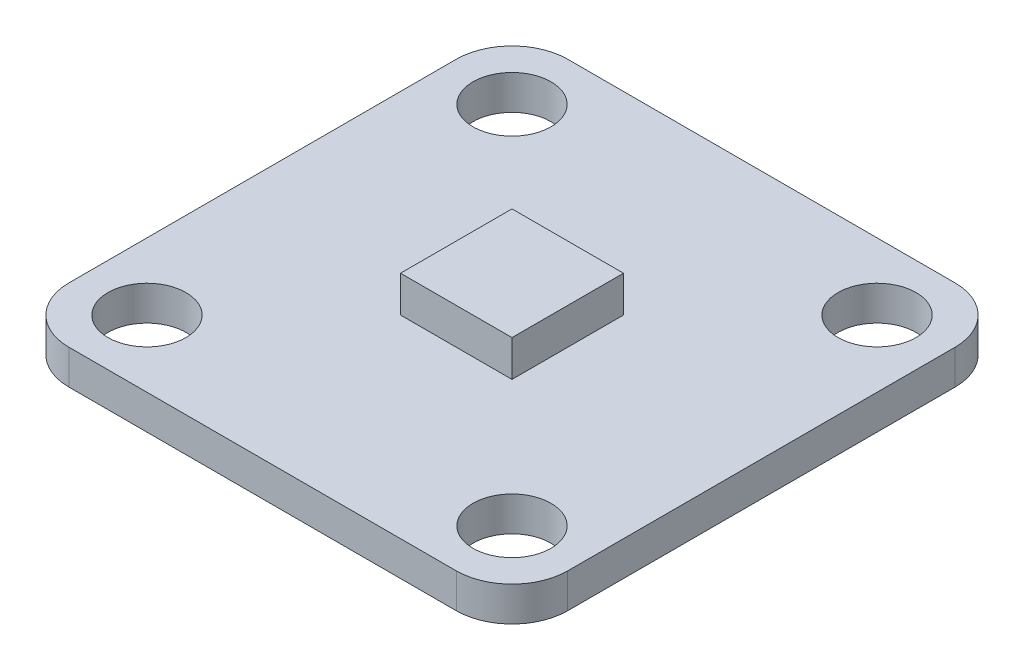
ISO-10303-21;
HEADER;
FILE_DESCRIPTION(('STEP AP214'),'2;1');
FILE_NAME('part.step','',(''),(''),'','','');
FILE_SCHEMA(('AUTOMOTIVE_DESIGN { 1 0 10303 214 1 1 1 1 }'));
ENDSEC;
DATA;
#1=APPLICATION_CONTEXT('core data for automotive mechanical design processes');
#2=APPLICATION_PROTOCOL_DEFINITION('international standard','automotive_design',2000,#1);
#3=PRODUCT_CONTEXT('',#1,'mechanical');
#4=PRODUCT('Part','Part','',(#3));
#5=PRODUCT_RELATED_PRODUCT_CATEGORY('part','',(#4));
#6=PRODUCT_DEFINITION_FORMATION('','',#4);
#7=PRODUCT_DEFINITION_CONTEXT('part definition',#1,'design');
#8=PRODUCT_DEFINITION('design','',#6,#7);
#9=PRODUCT_DEFINITION_SHAPE('','',#8);
#10=(LENGTH_UNIT() NAMED_UNIT(*) SI_UNIT(.MILLI.,.METRE.));
#11=(NAMED_UNIT(*) PLANE_ANGLE_UNIT() SI_UNIT($,.RADIAN.));
#12=(NAMED_UNIT(*) SI_UNIT($,.STERADIAN.) SOLID_ANGLE_UNIT());
#13=UNCERTAINTY_MEASURE_WITH_UNIT(LENGTH_MEASURE(1.E-05),#10,'distance_accuracy_value','');
#14=(GEOMETRIC_REPRESENTATION_CONTEXT(3) GLOBAL_UNCERTAINTY_ASSIGNED_CONTEXT((#13)) GLOBAL_UNIT_ASSIGNED_CONTEXT((#10,
#11,#12)) REPRESENTATION_CONTEXT('',''));
#15=CARTESIAN_POINT('',(0.,0.,0.));
#16=DIRECTION('',(0.,0.,1.));
#17=DIRECTION('',(1.,0.,0.));
#18=AXIS2_PLACEMENT_3D('',#15,#16,#17);
#19=CARTESIAN_POINT('',(0.,26.884,0.));
#20=DIRECTION('',(0.,-1.,0.));
#21=DIRECTION('',(0.,0.,-1.));
#22=AXIS2_PLACEMENT_3D('',#19,#20,#21);
#23=PLANE('',#22);
#24=DIRECTION('',(1.,0.,0.));
#25=VECTOR('',#24,1.);
#26=CARTESIAN_POINT('',(0.0634999999999959,26.884,11.3665));
#27=LINE('',#26,#25);
#28=CARTESIAN_POINT('',(2.6035,26.884,11.3665));
#29=VERTEX_POINT('',#28);
#30=CARTESIAN_POINT('',(20.2565,26.884,11.3665));
#31=VERTEX_POINT('',#30);
#32=EDGE_CURVE('E202',#29,#31,#27,.T.);
#33=ORIENTED_EDGE('',*,*,#32,.T.);
#34=CARTESIAN_POINT('',(20.2565,26.884,8.8265));
#35=DIRECTION('',(0.,-1.,0.));
#36=DIRECTION('',(0.,0.,-1.));
#37=AXIS2_PLACEMENT_3D('',#34,#35,#36);
#38=CIRCLE('',#37,2.54);
#39=CARTESIAN_POINT('',(22.7965,26.884,8.8265));
#40=VERTEX_POINT('',#39);
#41=EDGE_CURVE('E244',#31,#40,#38,.F.);
#42=ORIENTED_EDGE('',*,*,#41,.T.);
#43=DIRECTION('',(0.,0.,-1.));
#44=VECTOR('',#43,1.);
#45=CARTESIAN_POINT('',(22.7965,26.884,11.3665));
#46=LINE('',#45,#44);
#47=CARTESIAN_POINT('',(22.7965,26.884,-8.8265));
#48=VERTEX_POINT('',#47);
#49=EDGE_CURVE('E222',#40,#48,#46,.T.);
#50=ORIENTED_EDGE('',*,*,#49,.T.);
#51=CARTESIAN_POINT('',(20.2565,26.884,-8.8265));
#52=DIRECTION('',(0.,-1.,0.));
#53=DIRECTION('',(0.,0.,-1.));
#54=AXIS2_PLACEMENT_3D('',#51,#52,#53);
#55=CIRCLE('',#54,2.54);
#56=CARTESIAN_POINT('',(20.2565,26.884,-11.3665));
#57=VERTEX_POINT('',#56);
#58=EDGE_CURVE('E238',#48,#57,#55,.F.);
#59=ORIENTED_EDGE('',*,*,#58,.T.);
#60=DIRECTION('',(1.,0.,0.));
#61=VECTOR('',#60,1.);
#62=CARTESIAN_POINT('',(0.0634999999999959,26.884,-11.3665));
#63=LINE('',#62,#61);
#64=CARTESIAN_POINT('',(2.6035,26.884,-11.3665));
#65=VERTEX_POINT('',#64);
#66=EDGE_CURVE('E218',#65,#57,#63,.T.);
#67=ORIENTED_EDGE('',*,*,#66,.F.);
#68=CARTESIAN_POINT('',(2.6035,26.884,-8.8265));
#69=DIRECTION('',(0.,-1.,0.));
#70=DIRECTION('',(0.,0.,-1.));
#71=AXIS2_PLACEMENT_3D('',#68,#69,#70);
#72=CIRCLE('',#71,2.54);
#73=CARTESIAN_POINT('',(0.0634999999999959,26.884,-8.8265));
#74=VERTEX_POINT('',#73);
#75=EDGE_CURVE('E235',#65,#74,#72,.F.);
#76=ORIENTED_EDGE('',*,*,#75,.T.);
#77=DIRECTION('',(0.,0.,-1.));
#78=VECTOR('',#77,1.);
#79=CARTESIAN_POINT('',(0.0634999999999959,26.884,11.3665));
#80=LINE('',#79,#78);
#81=CARTESIAN_POINT('',(0.0634999999999959,26.884,8.8265));
#82=VERTEX_POINT('',#81);
#83=EDGE_CURVE('E193',#82,#74,#80,.T.);
#84=ORIENTED_EDGE('',*,*,#83,.F.);
#85=CARTESIAN_POINT('',(2.6035,26.884,8.8265));
#86=DIRECTION('',(0.,-1.,0.));
#87=DIRECTION('',(0.,0.,-1.));
#88=AXIS2_PLACEMENT_3D('',#85,#86,#87);
#89=CIRCLE('',#88,2.54);
#90=EDGE_CURVE('E241',#82,#29,#89,.F.);
#91=ORIENTED_EDGE('',*,*,#90,.T.);
#92=EDGE_LOOP('',(#33,#42,#50,#59,#67,#76,#84,#91));
#93=FACE_BOUND('',#92,.T.);
#94=CARTESIAN_POINT('',(19.7485,26.884,-8.3185));
#95=DIRECTION('',(0.,1.,0.));
#96=DIRECTION('',(0.,0.,1.));
#97=AXIS2_PLACEMENT_3D('',#94,#95,#96);
#98=CIRCLE('',#97,1.778);
#99=CARTESIAN_POINT('',(19.7485,26.884,-6.5405));
#100=VERTEX_POINT('',#99);
#101=EDGE_CURVE('E177',#100,#100,#98,.T.);
#102=ORIENTED_EDGE('',*,*,#101,.F.);
#103=EDGE_LOOP('',(#102));
#104=FACE_BOUND('',#103,.T.);
#105=CARTESIAN_POINT('',(3.1115,26.884,8.3185));
#106=DIRECTION('',(0.,1.,0.));
#107=DIRECTION('',(0.,0.,1.));
#108=AXIS2_PLACEMENT_3D('',#105,#106,#107);
#109=CIRCLE('',#108,1.778);
#110=CARTESIAN_POINT('',(3.1115,26.884,10.0965));
#111=VERTEX_POINT('',#110);
#112=EDGE_CURVE('E163',#111,#111,#109,.T.);
#113=ORIENTED_EDGE('',*,*,#112,.F.);
#114=EDGE_LOOP('',(#113));
#115=FACE_BOUND('',#114,.T.);
#116=CARTESIAN_POINT('',(19.7485,26.884,8.31850000000001));
#117=DIRECTION('',(0.,1.,0.));
#118=DIRECTION('',(0.,0.,-1.));
#119=AXIS2_PLACEMENT_3D('',#116,#117,#118);
#120=CIRCLE('',#119,1.778);
#121=CARTESIAN_POINT('',(19.7485,26.884,6.54050000000001));
#122=VERTEX_POINT('',#121);
#123=EDGE_CURVE('E182',#122,#122,#120,.T.);
#124=ORIENTED_EDGE('',*,*,#123,.F.);
#125=EDGE_LOOP('',(#124));
#126=FACE_BOUND('',#125,.T.);
#127=CARTESIAN_POINT('',(3.1115,26.884,-8.3185));
#128=DIRECTION('',(0.,1.,0.));
#129=DIRECTION('',(0.,0.,-1.));
#130=AXIS2_PLACEMENT_3D('',#127,#128,#129);
#131=CIRCLE('',#130,1.778);
#132=CARTESIAN_POINT('',(3.1115,26.884,-10.0965));
#133=VERTEX_POINT('',#132);
#134=EDGE_CURVE('E173',#133,#133,#131,.T.);
#135=ORIENTED_EDGE('',*,*,#134,.F.);
#136=EDGE_LOOP('',(#135));
#137=FACE_BOUND('',#136,.T.);
#138=DIRECTION('',(0.,0.,-1.));
#139=VECTOR('',#138,1.);
#140=CARTESIAN_POINT('',(13.97,26.884,2.54));
#141=LINE('',#140,#139);
#142=CARTESIAN_POINT('',(13.97,26.884,2.54));
#143=VERTEX_POINT('',#142);
#144=CARTESIAN_POINT('',(13.97,26.884,-2.54));
#145=VERTEX_POINT('',#144);
#146=EDGE_CURVE('E156',#143,#145,#141,.T.);
#147=ORIENTED_EDGE('',*,*,#146,.F.);
#148=DIRECTION('',(1.,0.,0.));
#149=VECTOR('',#148,1.);
#150=CARTESIAN_POINT('',(8.89,26.884,2.54));
#151=LINE('',#150,#149);
#152=CARTESIAN_POINT('',(8.89,26.884,2.54));
#153=VERTEX_POINT('',#152);
#154=EDGE_CURVE('E153',#153,#143,#151,.T.);
#155=ORIENTED_EDGE('',*,*,#154,.F.);
#156=DIRECTION('',(0.,0.,1.));
#157=VECTOR('',#156,1.);
#158=CARTESIAN_POINT('',(8.89,26.884,2.54));
#159=LINE('',#158,#157);
#160=CARTESIAN_POINT('',(8.89,26.884,-2.54));
#161=VERTEX_POINT('',#160);
#162=EDGE_CURVE('E66',#161,#153,#159,.T.);
#163=ORIENTED_EDGE('',*,*,#162,.F.);
#164=DIRECTION('',(-1.,0.,0.));
#165=VECTOR('',#164,1.);
#166=CARTESIAN_POINT('',(8.89,26.884,-2.54));
#167=LINE('',#166,#165);
#168=EDGE_CURVE('E61',#145,#161,#167,.T.);
#169=ORIENTED_EDGE('',*,*,#168,.F.);
#170=EDGE_LOOP('',(#147,#155,#163,#169));
#171=FACE_BOUND('',#170,.T.);
#172=ADVANCED_FACE('F45',(#93,#104,#115,#126,#137,#171),#23,.F.);
#173=CARTESIAN_POINT('',(0.0634999999999959,25.3092,11.3665));
#174=DIRECTION('',(1.,0.,0.));
#175=DIRECTION('',(0.,0.,-1.));
#176=AXIS2_PLACEMENT_3D('',#173,#174,#175);
#177=PLANE('',#176);
#178=DIRECTION('',(0.,0.,-1.));
#179=VECTOR('',#178,1.);
#180=CARTESIAN_POINT('',(0.0634999999999959,25.3092,11.3665));
#181=LINE('',#180,#179);
#182=CARTESIAN_POINT('',(0.0634999999999959,25.3092,8.8265));
#183=VERTEX_POINT('',#182);
#184=CARTESIAN_POINT('',(0.0634999999999959,25.3092,-8.8265));
#185=VERTEX_POINT('',#184);
#186=EDGE_CURVE('E197',#183,#185,#181,.T.);
#187=ORIENTED_EDGE('',*,*,#186,.F.);
#188=DIRECTION('',(0.,1.,0.));
#189=VECTOR('',#188,1.);
#190=CARTESIAN_POINT('',(0.0634999999999959,26.884,8.8265));
#191=LINE('',#190,#189);
#192=EDGE_CURVE('E269',#183,#82,#191,.T.);
#193=ORIENTED_EDGE('',*,*,#192,.T.);
#194=ORIENTED_EDGE('',*,*,#83,.T.);
#195=DIRECTION('',(0.,1.,0.));
#196=VECTOR('',#195,1.);
#197=CARTESIAN_POINT('',(0.0634999999999959,25.3092,-8.8265));
#198=LINE('',#197,#196);
#199=EDGE_CURVE('E266',#74,#185,#198,.F.);
#200=ORIENTED_EDGE('',*,*,#199,.T.);
#201=EDGE_LOOP('',(#187,#193,#194,#200));
#202=FACE_BOUND('',#201,.T.);
#203=ADVANCED_FACE('F311',(#202),#177,.F.);
#204=CARTESIAN_POINT('',(0.0634999999999959,25.3092,-11.3665));
#205=DIRECTION('',(0.,0.,1.));
#206=DIRECTION('',(1.,0.,0.));
#207=AXIS2_PLACEMENT_3D('',#204,#205,#206);
#208=PLANE('',#207);
#209=ORIENTED_EDGE('',*,*,#66,.T.);
#210=DIRECTION('',(0.,1.,0.));
#211=VECTOR('',#210,1.);
#212=CARTESIAN_POINT('',(20.2565,25.3092,-11.3665));
#213=LINE('',#212,#211);
#214=CARTESIAN_POINT('',(20.2565,25.3092,-11.3665));
#215=VERTEX_POINT('',#214);
#216=EDGE_CURVE('E11',#57,#215,#213,.F.);
#217=ORIENTED_EDGE('',*,*,#216,.T.);
#218=DIRECTION('',(1.,0.,0.));
#219=VECTOR('',#218,1.);
#220=CARTESIAN_POINT('',(0.0634999999999959,25.3092,-11.3665));
#221=LINE('',#220,#219);
#222=CARTESIAN_POINT('',(2.6035,25.3092,-11.3665));
#223=VERTEX_POINT('',#222);
#224=EDGE_CURVE('E201',#223,#215,#221,.T.);
#225=ORIENTED_EDGE('',*,*,#224,.F.);
#226=DIRECTION('',(0.,1.,0.));
#227=VECTOR('',#226,1.);
#228=CARTESIAN_POINT('',(2.6035,25.3092,-11.3665));
#229=LINE('',#228,#227);
#230=EDGE_CURVE('E54',#223,#65,#229,.T.);
#231=ORIENTED_EDGE('',*,*,#230,.T.);
#232=EDGE_LOOP('',(#209,#217,#225,#231));
#233=FACE_BOUND('',#232,.T.);
#234=ADVANCED_FACE('F278',(#233),#208,.F.);
#235=CARTESIAN_POINT('',(22.7965,25.3092,11.3665));
#236=DIRECTION('',(1.,0.,0.));
#237=DIRECTION('',(0.,0.,-1.));
#238=AXIS2_PLACEMENT_3D('',#235,#236,#237);
#239=PLANE('',#238);
#240=ORIENTED_EDGE('',*,*,#49,.F.);
#241=DIRECTION('',(0.,1.,0.));
#242=VECTOR('',#241,1.);
#243=CARTESIAN_POINT('',(22.7965,25.3092,8.8265));
#244=LINE('',#243,#242);
#245=CARTESIAN_POINT('',(22.7965,25.3092,8.8265));
#246=VERTEX_POINT('',#245);
#247=EDGE_CURVE('E251',#40,#246,#244,.F.);
#248=ORIENTED_EDGE('',*,*,#247,.T.);
#249=DIRECTION('',(0.,0.,-1.));
#250=VECTOR('',#249,1.);
#251=CARTESIAN_POINT('',(22.7965,25.3092,11.3665));
#252=LINE('',#251,#250);
#253=CARTESIAN_POINT('',(22.7965,25.3092,-8.8265));
#254=VERTEX_POINT('',#253);
#255=EDGE_CURVE('E206',#246,#254,#252,.T.);
#256=ORIENTED_EDGE('',*,*,#255,.T.);
#257=DIRECTION('',(0.,1.,0.));
#258=VECTOR('',#257,1.);
#259=CARTESIAN_POINT('',(22.7965,26.884,-8.8265));
#260=LINE('',#259,#258);
#261=EDGE_CURVE('E247',#254,#48,#260,.T.);
#262=ORIENTED_EDGE('',*,*,#261,.T.);
#263=EDGE_LOOP('',(#240,#248,#256,#262));
#264=FACE_BOUND('',#263,.T.);
#265=ADVANCED_FACE('F291',(#264),#239,.T.);
#266=CARTESIAN_POINT('',(0.0634999999999959,25.3092,11.3665));
#267=DIRECTION('',(0.,0.,1.));
#268=DIRECTION('',(1.,0.,0.));
#269=AXIS2_PLACEMENT_3D('',#266,#267,#268);
#270=PLANE('',#269);
#271=DIRECTION('',(1.,0.,0.));
#272=VECTOR('',#271,1.);
#273=CARTESIAN_POINT('',(0.0634999999999959,25.3092,11.3665));
#274=LINE('',#273,#272);
#275=CARTESIAN_POINT('',(2.6035,25.3092,11.3665));
#276=VERTEX_POINT('',#275);
#277=CARTESIAN_POINT('',(20.2565,25.3092,11.3665));
#278=VERTEX_POINT('',#277);
#279=EDGE_CURVE('E210',#276,#278,#274,.T.);
#280=ORIENTED_EDGE('',*,*,#279,.T.);
#281=DIRECTION('',(0.,1.,0.));
#282=VECTOR('',#281,1.);
#283=CARTESIAN_POINT('',(20.2565,25.3092,11.3665));
#284=LINE('',#283,#282);
#285=EDGE_CURVE('E231',#278,#31,#284,.T.);
#286=ORIENTED_EDGE('',*,*,#285,.T.);
#287=ORIENTED_EDGE('',*,*,#32,.F.);
#288=DIRECTION('',(0.,1.,0.));
#289=VECTOR('',#288,1.);
#290=CARTESIAN_POINT('',(2.6035,25.3092,11.3665));
#291=LINE('',#290,#289);
#292=EDGE_CURVE('E214',#29,#276,#291,.F.);
#293=ORIENTED_EDGE('',*,*,#292,.T.);
#294=EDGE_LOOP('',(#280,#286,#287,#293));
#295=FACE_BOUND('',#294,.T.);
#296=ADVANCED_FACE('F303',(#295),#270,.T.);
#297=CARTESIAN_POINT('',(0.,25.3092,0.));
#298=DIRECTION('',(0.,-1.,0.));
#299=DIRECTION('',(0.,0.,-1.));
#300=AXIS2_PLACEMENT_3D('',#297,#298,#299);
#301=PLANE('',#300);
#302=CARTESIAN_POINT('',(3.1115,25.3092,-8.3185));
#303=DIRECTION('',(0.,1.,0.));
#304=DIRECTION('',(0.,0.,-1.));
#305=AXIS2_PLACEMENT_3D('',#302,#303,#304);
#306=CIRCLE('',#305,1.778);
#307=CARTESIAN_POINT('',(3.1115,25.3092,-10.0965));
#308=VERTEX_POINT('',#307);
#309=EDGE_CURVE('E178',#308,#308,#306,.T.);
#310=ORIENTED_EDGE('',*,*,#309,.T.);
#311=EDGE_LOOP('',(#310));
#312=FACE_BOUND('',#311,.T.);
#313=CARTESIAN_POINT('',(19.7485,25.3092,8.31850000000001));
#314=DIRECTION('',(0.,1.,0.));
#315=DIRECTION('',(0.,0.,-1.));
#316=AXIS2_PLACEMENT_3D('',#313,#314,#315);
#317=CIRCLE('',#316,1.778);
#318=CARTESIAN_POINT('',(19.7485,25.3092,6.54050000000001));
#319=VERTEX_POINT('',#318);
#320=EDGE_CURVE('E171',#319,#319,#317,.T.);
#321=ORIENTED_EDGE('',*,*,#320,.T.);
#322=EDGE_LOOP('',(#321));
#323=FACE_BOUND('',#322,.T.);
#324=CARTESIAN_POINT('',(3.1115,25.3092,8.3185));
#325=DIRECTION('',(0.,1.,0.));
#326=DIRECTION('',(0.,0.,1.));
#327=AXIS2_PLACEMENT_3D('',#324,#325,#326);
#328=CIRCLE('',#327,1.778);
#329=CARTESIAN_POINT('',(3.1115,25.3092,10.0965));
#330=VERTEX_POINT('',#329);
#331=EDGE_CURVE('E158',#330,#330,#328,.T.);
#332=ORIENTED_EDGE('',*,*,#331,.T.);
#333=EDGE_LOOP('',(#332));
#334=FACE_BOUND('',#333,.T.);
#335=CARTESIAN_POINT('',(19.7485,25.3092,-8.3185));
#336=DIRECTION('',(0.,1.,0.));
#337=DIRECTION('',(0.,0.,1.));
#338=AXIS2_PLACEMENT_3D('',#335,#336,#337);
#339=CIRCLE('',#338,1.778);
#340=CARTESIAN_POINT('',(19.7485,25.3092,-6.5405));
#341=VERTEX_POINT('',#340);
#342=EDGE_CURVE('E189',#341,#341,#339,.T.);
#343=ORIENTED_EDGE('',*,*,#342,.T.);
#344=EDGE_LOOP('',(#343));
#345=FACE_BOUND('',#344,.T.);
#346=ORIENTED_EDGE('',*,*,#255,.F.);
#347=CARTESIAN_POINT('',(20.2565,25.3092,8.8265));
#348=DIRECTION('',(0.,-1.,0.));
#349=DIRECTION('',(0.,0.,-1.));
#350=AXIS2_PLACEMENT_3D('',#347,#348,#349);
#351=CIRCLE('',#350,2.54);
#352=EDGE_CURVE('E263',#246,#278,#351,.T.);
#353=ORIENTED_EDGE('',*,*,#352,.T.);
#354=ORIENTED_EDGE('',*,*,#279,.F.);
#355=CARTESIAN_POINT('',(2.6035,25.3092,8.8265));
#356=DIRECTION('',(0.,-1.,0.));
#357=DIRECTION('',(0.,0.,-1.));
#358=AXIS2_PLACEMENT_3D('',#355,#356,#357);
#359=CIRCLE('',#358,2.54);
#360=EDGE_CURVE('E260',#276,#183,#359,.T.);
#361=ORIENTED_EDGE('',*,*,#360,.T.);
#362=ORIENTED_EDGE('',*,*,#186,.T.);
#363=CARTESIAN_POINT('',(2.6035,25.3092,-8.8265));
#364=DIRECTION('',(0.,-1.,0.));
#365=DIRECTION('',(0.,0.,-1.));
#366=AXIS2_PLACEMENT_3D('',#363,#364,#365);
#367=CIRCLE('',#366,2.54);
#368=EDGE_CURVE('E254',#185,#223,#367,.T.);
#369=ORIENTED_EDGE('',*,*,#368,.T.);
#370=ORIENTED_EDGE('',*,*,#224,.T.);
#371=CARTESIAN_POINT('',(20.2565,25.3092,-8.8265));
#372=DIRECTION('',(0.,-1.,0.));
#373=DIRECTION('',(0.,0.,-1.));
#374=AXIS2_PLACEMENT_3D('',#371,#372,#373);
#375=CIRCLE('',#374,2.54);
#376=EDGE_CURVE('E257',#215,#254,#375,.T.);
#377=ORIENTED_EDGE('',*,*,#376,.T.);
#378=EDGE_LOOP('',(#346,#353,#354,#361,#362,#369,#370,#377));
#379=FACE_BOUND('',#378,.T.);
#380=ADVANCED_FACE('F296',(#312,#323,#334,#345,#379),#301,.T.);
#381=CARTESIAN_POINT('',(20.2565,25.3092,8.8265));
#382=DIRECTION('',(0.,1.,0.));
#383=DIRECTION('',(0.,0.,1.));
#384=AXIS2_PLACEMENT_3D('',#381,#382,#383);
#385=CYLINDRICAL_SURFACE('',#384,2.54);
#386=ORIENTED_EDGE('',*,*,#352,.F.);
#387=ORIENTED_EDGE('',*,*,#247,.F.);
#388=ORIENTED_EDGE('',*,*,#41,.F.);
#389=ORIENTED_EDGE('',*,*,#285,.F.);
#390=EDGE_LOOP('',(#386,#387,#388,#389));
#391=FACE_BOUND('',#390,.T.);
#392=ADVANCED_FACE('F300',(#391),#385,.T.);
#393=CARTESIAN_POINT('',(2.6035,25.3092,8.8265));
#394=DIRECTION('',(0.,-1.,0.));
#395=DIRECTION('',(0.,0.,-1.));
#396=AXIS2_PLACEMENT_3D('',#393,#394,#395);
#397=CYLINDRICAL_SURFACE('',#396,2.54);
#398=ORIENTED_EDGE('',*,*,#360,.F.);
#399=ORIENTED_EDGE('',*,*,#292,.F.);
#400=ORIENTED_EDGE('',*,*,#90,.F.);
#401=ORIENTED_EDGE('',*,*,#192,.F.);
#402=EDGE_LOOP('',(#398,#399,#400,#401));
#403=FACE_BOUND('',#402,.T.);
#404=ADVANCED_FACE('F308',(#403),#397,.T.);
#405=CARTESIAN_POINT('',(20.2565,25.3092,-8.8265));
#406=DIRECTION('',(0.,-1.,0.));
#407=DIRECTION('',(0.,0.,-1.));
#408=AXIS2_PLACEMENT_3D('',#405,#406,#407);
#409=CYLINDRICAL_SURFACE('',#408,2.54);
#410=ORIENTED_EDGE('',*,*,#376,.F.);
#411=ORIENTED_EDGE('',*,*,#216,.F.);
#412=ORIENTED_EDGE('',*,*,#58,.F.);
#413=ORIENTED_EDGE('',*,*,#261,.F.);
#414=EDGE_LOOP('',(#410,#411,#412,#413));
#415=FACE_BOUND('',#414,.T.);
#416=ADVANCED_FACE('F289',(#415),#409,.T.);
#417=CARTESIAN_POINT('',(2.6035,25.3092,-8.8265));
#418=DIRECTION('',(0.,1.,0.));
#419=DIRECTION('',(0.,0.,1.));
#420=AXIS2_PLACEMENT_3D('',#417,#418,#419);
#421=CYLINDRICAL_SURFACE('',#420,2.54);
#422=ORIENTED_EDGE('',*,*,#368,.F.);
#423=ORIENTED_EDGE('',*,*,#199,.F.);
#424=ORIENTED_EDGE('',*,*,#75,.F.);
#425=ORIENTED_EDGE('',*,*,#230,.F.);
#426=EDGE_LOOP('',(#422,#423,#424,#425));
#427=FACE_BOUND('',#426,.T.);
#428=ADVANCED_FACE('F47',(#427),#421,.T.);
#429=CARTESIAN_POINT('',(19.7485,25.3092,-8.3185));
#430=DIRECTION('',(0.,1.,0.));
#431=DIRECTION('',(0.,0.,1.));
#432=AXIS2_PLACEMENT_3D('',#429,#430,#431);
#433=CYLINDRICAL_SURFACE('',#432,1.778);
#434=ORIENTED_EDGE('',*,*,#342,.F.);
#435=EDGE_LOOP('',(#434));
#436=FACE_BOUND('',#435,.T.);
#437=ORIENTED_EDGE('',*,*,#101,.T.);
#438=EDGE_LOOP('',(#437));
#439=FACE_BOUND('',#438,.T.);
#440=ADVANCED_FACE('F314',(#436,#439),#433,.F.);
#441=CARTESIAN_POINT('',(3.1115,25.3092,8.3185));
#442=DIRECTION('',(0.,1.,0.));
#443=DIRECTION('',(0.,0.,1.));
#444=AXIS2_PLACEMENT_3D('',#441,#442,#443);
#445=CYLINDRICAL_SURFACE('',#444,1.778);
#446=ORIENTED_EDGE('',*,*,#331,.F.);
#447=EDGE_LOOP('',(#446));
#448=FACE_BOUND('',#447,.T.);
#449=ORIENTED_EDGE('',*,*,#112,.T.);
#450=EDGE_LOOP('',(#449));
#451=FACE_BOUND('',#450,.T.);
#452=ADVANCED_FACE('F320',(#448,#451),#445,.F.);
#453=CARTESIAN_POINT('',(19.7485,25.3092,8.31850000000001));
#454=DIRECTION('',(0.,1.,0.));
#455=DIRECTION('',(0.,0.,1.));
#456=AXIS2_PLACEMENT_3D('',#453,#454,#455);
#457=CYLINDRICAL_SURFACE('',#456,1.778);
#458=ORIENTED_EDGE('',*,*,#320,.F.);
#459=EDGE_LOOP('',(#458));
#460=FACE_BOUND('',#459,.T.);
#461=ORIENTED_EDGE('',*,*,#123,.T.);
#462=EDGE_LOOP('',(#461));
#463=FACE_BOUND('',#462,.T.);
#464=ADVANCED_FACE('F371',(#460,#463),#457,.F.);
#465=CARTESIAN_POINT('',(3.1115,25.3092,-8.3185));
#466=DIRECTION('',(0.,1.,0.));
#467=DIRECTION('',(0.,0.,1.));
#468=AXIS2_PLACEMENT_3D('',#465,#466,#467);
#469=CYLINDRICAL_SURFACE('',#468,1.778);
#470=ORIENTED_EDGE('',*,*,#309,.F.);
#471=EDGE_LOOP('',(#470));
#472=FACE_BOUND('',#471,.T.);
#473=ORIENTED_EDGE('',*,*,#134,.T.);
#474=EDGE_LOOP('',(#473));
#475=FACE_BOUND('',#474,.T.);
#476=ADVANCED_FACE('F381',(#472,#475),#469,.F.);
#477=CARTESIAN_POINT('',(13.97,28.535,2.54));
#478=DIRECTION('',(-1.,0.,0.));
#479=DIRECTION('',(0.,0.,1.));
#480=AXIS2_PLACEMENT_3D('',#477,#478,#479);
#481=PLANE('',#480);
#482=ORIENTED_EDGE('',*,*,#146,.T.);
#483=DIRECTION('',(0.,-1.,0.));
#484=VECTOR('',#483,1.);
#485=CARTESIAN_POINT('',(13.97,28.535,-2.54));
#486=LINE('',#485,#484);
#487=CARTESIAN_POINT('',(13.97,28.535,-2.54));
#488=VERTEX_POINT('',#487);
#489=EDGE_CURVE('E135',#488,#145,#486,.T.);
#490=ORIENTED_EDGE('',*,*,#489,.F.);
#491=DIRECTION('',(0.,0.,-1.));
#492=VECTOR('',#491,1.);
#493=CARTESIAN_POINT('',(13.97,28.535,2.54));
#494=LINE('',#493,#492);
#495=CARTESIAN_POINT('',(13.97,28.535,2.54));
#496=VERTEX_POINT('',#495);
#497=EDGE_CURVE('E143',#496,#488,#494,.T.);
#498=ORIENTED_EDGE('',*,*,#497,.F.);
#499=DIRECTION('',(0.,-1.,0.));
#500=VECTOR('',#499,1.);
#501=CARTESIAN_POINT('',(13.97,28.535,2.54));
#502=LINE('',#501,#500);
#503=EDGE_CURVE('E442',#496,#143,#502,.T.);
#504=ORIENTED_EDGE('',*,*,#503,.T.);
#505=EDGE_LOOP('',(#482,#490,#498,#504));
#506=FACE_BOUND('',#505,.T.);
#507=ADVANCED_FACE('F155',(#506),#481,.F.);
#508=CARTESIAN_POINT('',(8.89,28.535,-2.54));
#509=DIRECTION('',(0.,0.,1.));
#510=DIRECTION('',(1.,0.,0.));
#511=AXIS2_PLACEMENT_3D('',#508,#509,#510);
#512=PLANE('',#511);
#513=ORIENTED_EDGE('',*,*,#168,.T.);
#514=DIRECTION('',(0.,-1.,0.));
#515=VECTOR('',#514,1.);
#516=CARTESIAN_POINT('',(8.89,28.535,-2.54));
#517=LINE('',#516,#515);
#518=CARTESIAN_POINT('',(8.89,28.535,-2.54));
#519=VERTEX_POINT('',#518);
#520=EDGE_CURVE('E138',#519,#161,#517,.T.);
#521=ORIENTED_EDGE('',*,*,#520,.F.);
#522=DIRECTION('',(-1.,0.,0.));
#523=VECTOR('',#522,1.);
#524=CARTESIAN_POINT('',(8.89,28.535,-2.54));
#525=LINE('',#524,#523);
#526=EDGE_CURVE('E131',#488,#519,#525,.T.);
#527=ORIENTED_EDGE('',*,*,#526,.F.);
#528=ORIENTED_EDGE('',*,*,#489,.T.);
#529=EDGE_LOOP('',(#513,#521,#527,#528));
#530=FACE_BOUND('',#529,.T.);
#531=ADVANCED_FACE('F133',(#530),#512,.F.);
#532=CARTESIAN_POINT('',(8.89,28.535,2.54));
#533=DIRECTION('',(1.,0.,0.));
#534=DIRECTION('',(0.,0.,-1.));
#535=AXIS2_PLACEMENT_3D('',#532,#533,#534);
#536=PLANE('',#535);
#537=ORIENTED_EDGE('',*,*,#162,.T.);
#538=DIRECTION('',(0.,-1.,0.));
#539=VECTOR('',#538,1.);
#540=CARTESIAN_POINT('',(8.89,28.535,2.54));
#541=LINE('',#540,#539);
#542=CARTESIAN_POINT('',(8.89,28.535,2.54));
#543=VERTEX_POINT('',#542);
#544=EDGE_CURVE('E165',#543,#153,#541,.T.);
#545=ORIENTED_EDGE('',*,*,#544,.F.);
#546=DIRECTION('',(0.,0.,1.));
#547=VECTOR('',#546,1.);
#548=CARTESIAN_POINT('',(8.89,28.535,2.54));
#549=LINE('',#548,#547);
#550=EDGE_CURVE('E142',#519,#543,#549,.T.);
#551=ORIENTED_EDGE('',*,*,#550,.F.);
#552=ORIENTED_EDGE('',*,*,#520,.T.);
#553=EDGE_LOOP('',(#537,#545,#551,#552));
#554=FACE_BOUND('',#553,.T.);
#555=ADVANCED_FACE('F410',(#554),#536,.F.);
#556=CARTESIAN_POINT('',(8.89,28.535,2.54));
#557=DIRECTION('',(0.,0.,-1.));
#558=DIRECTION('',(-1.,0.,0.));
#559=AXIS2_PLACEMENT_3D('',#556,#557,#558);
#560=PLANE('',#559);
#561=ORIENTED_EDGE('',*,*,#154,.T.);
#562=ORIENTED_EDGE('',*,*,#503,.F.);
#563=DIRECTION('',(1.,0.,0.));
#564=VECTOR('',#563,1.);
#565=CARTESIAN_POINT('',(8.89,28.535,2.54));
#566=LINE('',#565,#564);
#567=EDGE_CURVE('E148',#543,#496,#566,.T.);
#568=ORIENTED_EDGE('',*,*,#567,.F.);
#569=ORIENTED_EDGE('',*,*,#544,.T.);
#570=EDGE_LOOP('',(#561,#562,#568,#569));
#571=FACE_BOUND('',#570,.T.);
#572=ADVANCED_FACE('F419',(#571),#560,.F.);
#573=CARTESIAN_POINT('',(0.,28.535,0.));
#574=DIRECTION('',(0.,-1.,0.));
#575=DIRECTION('',(0.,0.,-1.));
#576=AXIS2_PLACEMENT_3D('',#573,#574,#575);
#577=PLANE('',#576);
#578=ORIENTED_EDGE('',*,*,#497,.T.);
#579=ORIENTED_EDGE('',*,*,#526,.T.);
#580=ORIENTED_EDGE('',*,*,#550,.T.);
#581=ORIENTED_EDGE('',*,*,#567,.T.);
#582=EDGE_LOOP('',(#578,#579,#580,#581));
#583=FACE_BOUND('',#582,.T.);
#584=ADVANCED_FACE('F146',(#583),#577,.F.);
#585=CLOSED_SHELL('',(#172,#203,#234,#265,#296,#380,#392,#404,#416,#428,#440,#452,#464,#476,
#507,#531,#555,#572,#584));
#586=MANIFOLD_SOLID_BREP('B2',#585);
#587=ADVANCED_BREP_SHAPE_REPRESENTATION('',(#18,#586),#14);
#588=SHAPE_DEFINITION_REPRESENTATION(#9,#587);
ENDSEC;
END-ISO-10303-21;
